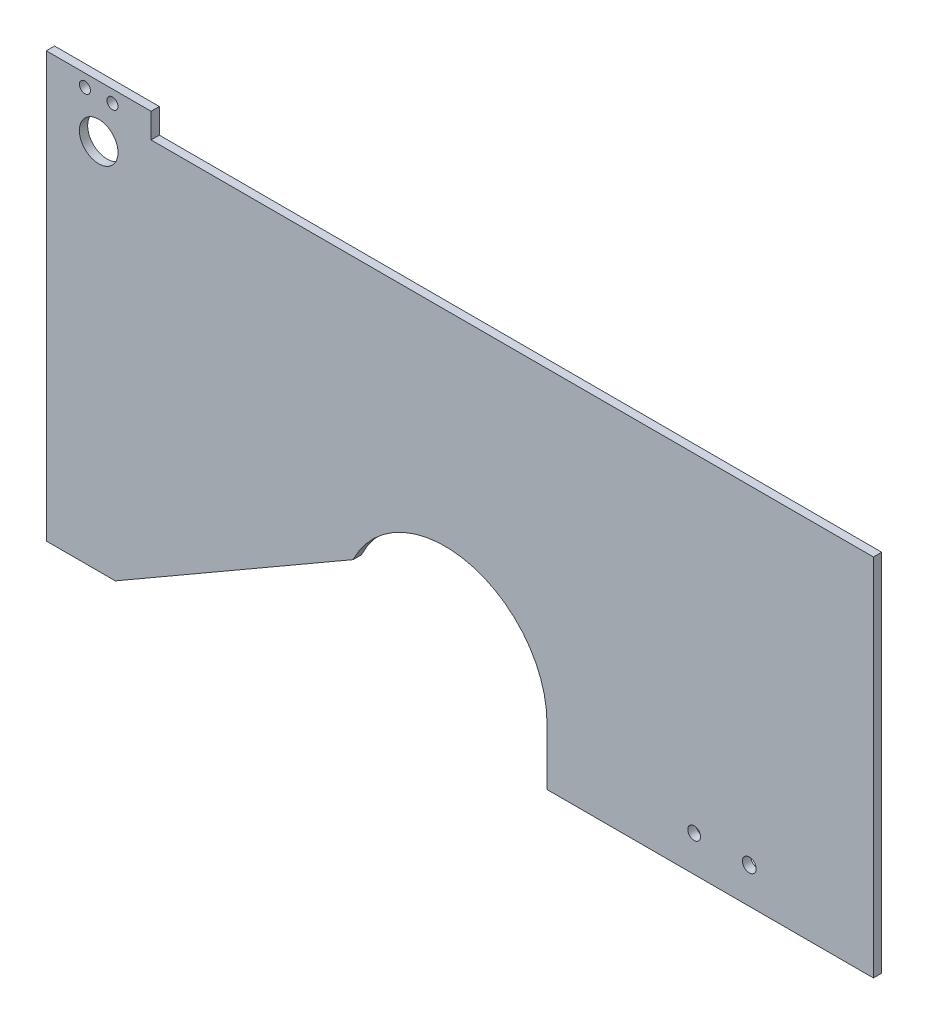
ISO-10303-21;
HEADER;
FILE_DESCRIPTION(('STEP AP214'),'2;1');
FILE_NAME('part.step','',(''),(''),'','','');
FILE_SCHEMA(('AUTOMOTIVE_DESIGN { 1 0 10303 214 1 1 1 1 }'));
ENDSEC;
DATA;
#1=APPLICATION_CONTEXT('core data for automotive mechanical design processes');
#2=APPLICATION_PROTOCOL_DEFINITION('international standard','automotive_design',2000,#1);
#3=PRODUCT_CONTEXT('',#1,'mechanical');
#4=PRODUCT('Part','Part','',(#3));
#5=PRODUCT_RELATED_PRODUCT_CATEGORY('part','',(#4));
#6=PRODUCT_DEFINITION_FORMATION('','',#4);
#7=PRODUCT_DEFINITION_CONTEXT('part definition',#1,'design');
#8=PRODUCT_DEFINITION('design','',#6,#7);
#9=PRODUCT_DEFINITION_SHAPE('','',#8);
#10=(LENGTH_UNIT() NAMED_UNIT(*) SI_UNIT(.MILLI.,.METRE.));
#11=(NAMED_UNIT(*) PLANE_ANGLE_UNIT() SI_UNIT($,.RADIAN.));
#12=(NAMED_UNIT(*) SI_UNIT($,.STERADIAN.) SOLID_ANGLE_UNIT());
#13=UNCERTAINTY_MEASURE_WITH_UNIT(LENGTH_MEASURE(1.E-05),#10,'distance_accuracy_value','');
#14=(GEOMETRIC_REPRESENTATION_CONTEXT(3) GLOBAL_UNCERTAINTY_ASSIGNED_CONTEXT((#13)) GLOBAL_UNIT_ASSIGNED_CONTEXT((#10,
#11,#12)) REPRESENTATION_CONTEXT('',''));
#15=CARTESIAN_POINT('',(0.,0.,0.));
#16=DIRECTION('',(0.,0.,1.));
#17=DIRECTION('',(1.,0.,0.));
#18=AXIS2_PLACEMENT_3D('',#15,#16,#17);
#19=CARTESIAN_POINT('',(144.6,33.7,3.));
#20=DIRECTION('',(0.,0.,1.));
#21=DIRECTION('',(1.,0.,0.));
#22=AXIS2_PLACEMENT_3D('',#19,#20,#21);
#23=PLANE('',#22);
#24=CARTESIAN_POINT('',(254.98,25.75,3.));
#25=DIRECTION('',(0.,0.,1.));
#26=DIRECTION('',(1.,0.,0.));
#27=AXIS2_PLACEMENT_3D('',#24,#25,#26);
#28=CIRCLE('',#27,2.50000000000002);
#29=CARTESIAN_POINT('',(257.48,25.75,3.));
#30=VERTEX_POINT('',#29);
#31=EDGE_CURVE('E278',#30,#30,#28,.T.);
#32=ORIENTED_EDGE('',*,*,#31,.F.);
#33=EDGE_LOOP('',(#32));
#34=FACE_BOUND('',#33,.T.);
#35=CARTESIAN_POINT('',(234.98,25.75,3.));
#36=DIRECTION('',(0.,0.,1.));
#37=DIRECTION('',(1.,0.,0.));
#38=AXIS2_PLACEMENT_3D('',#35,#36,#37);
#39=CIRCLE('',#38,2.30606373485607);
#40=CARTESIAN_POINT('',(237.286063734856,25.75,3.));
#41=VERTEX_POINT('',#40);
#42=EDGE_CURVE('E270',#41,#41,#39,.T.);
#43=ORIENTED_EDGE('',*,*,#42,.F.);
#44=EDGE_LOOP('',(#43));
#45=FACE_BOUND('',#44,.T.);
#46=DIRECTION('',(-1.,0.,0.));
#47=VECTOR('',#46,1.);
#48=CARTESIAN_POINT('',(181.6,12.75,3.));
#49=LINE('',#48,#47);
#50=CARTESIAN_POINT('',(300.,12.75,3.));
#51=VERTEX_POINT('',#50);
#52=CARTESIAN_POINT('',(181.6,12.75,3.));
#53=VERTEX_POINT('',#52);
#54=EDGE_CURVE('E263',#51,#53,#49,.T.);
#55=ORIENTED_EDGE('',*,*,#54,.F.);
#56=DIRECTION('',(0.,1.,0.));
#57=VECTOR('',#56,1.);
#58=CARTESIAN_POINT('',(300.,0.,3.));
#59=LINE('',#58,#57);
#60=CARTESIAN_POINT('',(300.,145.,3.));
#61=VERTEX_POINT('',#60);
#62=EDGE_CURVE('E128',#51,#61,#59,.T.);
#63=ORIENTED_EDGE('',*,*,#62,.T.);
#64=DIRECTION('',(-1.,0.,0.));
#65=VECTOR('',#64,1.);
#66=CARTESIAN_POINT('',(38.,145.,3.));
#67=LINE('',#66,#65);
#68=CARTESIAN_POINT('',(38.,145.,3.));
#69=VERTEX_POINT('',#68);
#70=EDGE_CURVE('E120',#61,#69,#67,.T.);
#71=ORIENTED_EDGE('',*,*,#70,.T.);
#72=DIRECTION('',(0.,1.,0.));
#73=VECTOR('',#72,1.);
#74=CARTESIAN_POINT('',(38.,154.,3.));
#75=LINE('',#74,#73);
#76=CARTESIAN_POINT('',(38.,154.,3.));
#77=VERTEX_POINT('',#76);
#78=EDGE_CURVE('E125',#69,#77,#75,.T.);
#79=ORIENTED_EDGE('',*,*,#78,.T.);
#80=DIRECTION('',(-1.,0.,0.));
#81=VECTOR('',#80,1.);
#82=CARTESIAN_POINT('',(19.,154.,3.));
#83=LINE('',#82,#81);
#84=CARTESIAN_POINT('',(0.,154.,3.));
#85=VERTEX_POINT('',#84);
#86=EDGE_CURVE('E64',#77,#85,#83,.T.);
#87=ORIENTED_EDGE('',*,*,#86,.T.);
#88=DIRECTION('',(0.,-1.,0.));
#89=VECTOR('',#88,1.);
#90=CARTESIAN_POINT('',(0.,0.,3.));
#91=LINE('',#90,#89);
#92=CARTESIAN_POINT('',(0.,0.,3.));
#93=VERTEX_POINT('',#92);
#94=EDGE_CURVE('E182',#85,#93,#91,.T.);
#95=ORIENTED_EDGE('',*,*,#94,.T.);
#96=DIRECTION('',(1.,0.,0.));
#97=VECTOR('',#96,1.);
#98=CARTESIAN_POINT('',(0.,0.,3.));
#99=LINE('',#98,#97);
#100=CARTESIAN_POINT('',(25.030359010412,0.,3.));
#101=VERTEX_POINT('',#100);
#102=EDGE_CURVE('E104',#93,#101,#99,.T.);
#103=ORIENTED_EDGE('',*,*,#102,.T.);
#104=DIRECTION('',(0.866025403784438,0.500000000000001,0.));
#105=VECTOR('',#104,1.);
#106=CARTESIAN_POINT('',(25.030359010412,0.,3.));
#107=LINE('',#106,#105);
#108=CARTESIAN_POINT('',(111.286489227342,49.8000000000001,3.));
#109=VERTEX_POINT('',#108);
#110=EDGE_CURVE('E203',#101,#109,#107,.T.);
#111=ORIENTED_EDGE('',*,*,#110,.T.);
#112=CARTESIAN_POINT('',(144.6,33.7,3.));
#113=DIRECTION('',(0.,0.,-1.));
#114=DIRECTION('',(1.,0.,0.));
#115=AXIS2_PLACEMENT_3D('',#112,#113,#114);
#116=CIRCLE('',#115,37.);
#117=CARTESIAN_POINT('',(181.6,33.7,3.));
#118=VERTEX_POINT('',#117);
#119=EDGE_CURVE('E223',#109,#118,#116,.T.);
#120=ORIENTED_EDGE('',*,*,#119,.T.);
#121=DIRECTION('',(0.,-1.,0.));
#122=VECTOR('',#121,1.);
#123=CARTESIAN_POINT('',(181.6,33.7,3.));
#124=LINE('',#123,#122);
#125=EDGE_CURVE('E220',#118,#53,#124,.T.);
#126=ORIENTED_EDGE('',*,*,#125,.T.);
#127=EDGE_LOOP('',(#55,#63,#71,#79,#87,#95,#103,#111,#120,#126));
#128=FACE_BOUND('',#127,.T.);
#129=CARTESIAN_POINT('',(14.,149.5,3.));
#130=DIRECTION('',(0.,0.,1.));
#131=DIRECTION('',(1.,0.,0.));
#132=AXIS2_PLACEMENT_3D('',#129,#130,#131);
#133=CIRCLE('',#132,2.00000000000001);
#134=CARTESIAN_POINT('',(16.,149.5,3.));
#135=VERTEX_POINT('',#134);
#136=EDGE_CURVE('E239',#135,#135,#133,.T.);
#137=ORIENTED_EDGE('',*,*,#136,.F.);
#138=EDGE_LOOP('',(#137));
#139=FACE_BOUND('',#138,.T.);
#140=CARTESIAN_POINT('',(19.,135.,3.));
#141=DIRECTION('',(0.,0.,1.));
#142=DIRECTION('',(1.,0.,0.));
#143=AXIS2_PLACEMENT_3D('',#140,#141,#142);
#144=CIRCLE('',#143,7.);
#145=CARTESIAN_POINT('',(26.,135.,3.));
#146=VERTEX_POINT('',#145);
#147=EDGE_CURVE('E159',#146,#146,#144,.T.);
#148=ORIENTED_EDGE('',*,*,#147,.F.);
#149=EDGE_LOOP('',(#148));
#150=FACE_BOUND('',#149,.T.);
#151=CARTESIAN_POINT('',(24.,149.5,3.));
#152=DIRECTION('',(0.,0.,1.));
#153=DIRECTION('',(-1.,0.,0.));
#154=AXIS2_PLACEMENT_3D('',#151,#152,#153);
#155=CIRCLE('',#154,2.00000000000001);
#156=CARTESIAN_POINT('',(22.,149.5,3.));
#157=VERTEX_POINT('',#156);
#158=EDGE_CURVE('E247',#157,#157,#155,.T.);
#159=ORIENTED_EDGE('',*,*,#158,.F.);
#160=EDGE_LOOP('',(#159));
#161=FACE_BOUND('',#160,.T.);
#162=ADVANCED_FACE('F39',(#34,#45,#128,#139,#150,#161),#23,.T.);
#163=CARTESIAN_POINT('',(144.6,33.7,0.));
#164=DIRECTION('',(0.,0.,1.));
#165=DIRECTION('',(1.,0.,0.));
#166=AXIS2_PLACEMENT_3D('',#163,#164,#165);
#167=PLANE('',#166);
#168=CARTESIAN_POINT('',(254.98,25.75,0.));
#169=DIRECTION('',(0.,0.,1.));
#170=DIRECTION('',(1.,0.,0.));
#171=AXIS2_PLACEMENT_3D('',#168,#169,#170);
#172=CIRCLE('',#171,2.50000000000002);
#173=CARTESIAN_POINT('',(257.48,25.75,0.));
#174=VERTEX_POINT('',#173);
#175=EDGE_CURVE('E267',#174,#174,#172,.T.);
#176=ORIENTED_EDGE('',*,*,#175,.T.);
#177=EDGE_LOOP('',(#176));
#178=FACE_BOUND('',#177,.T.);
#179=CARTESIAN_POINT('',(234.98,25.75,0.));
#180=DIRECTION('',(0.,0.,1.));
#181=DIRECTION('',(1.,0.,0.));
#182=AXIS2_PLACEMENT_3D('',#179,#180,#181);
#183=CIRCLE('',#182,2.30606373485607);
#184=CARTESIAN_POINT('',(237.286063734856,25.75,0.));
#185=VERTEX_POINT('',#184);
#186=EDGE_CURVE('E274',#185,#185,#183,.T.);
#187=ORIENTED_EDGE('',*,*,#186,.T.);
#188=EDGE_LOOP('',(#187));
#189=FACE_BOUND('',#188,.T.);
#190=DIRECTION('',(0.,1.,0.));
#191=VECTOR('',#190,1.);
#192=CARTESIAN_POINT('',(300.,0.,0.));
#193=LINE('',#192,#191);
#194=CARTESIAN_POINT('',(300.,12.75,0.));
#195=VERTEX_POINT('',#194);
#196=CARTESIAN_POINT('',(300.,145.,0.));
#197=VERTEX_POINT('',#196);
#198=EDGE_CURVE('E172',#195,#197,#193,.T.);
#199=ORIENTED_EDGE('',*,*,#198,.F.);
#200=DIRECTION('',(-1.,0.,0.));
#201=VECTOR('',#200,1.);
#202=CARTESIAN_POINT('',(181.6,12.75,0.));
#203=LINE('',#202,#201);
#204=CARTESIAN_POINT('',(181.6,12.75,0.));
#205=VERTEX_POINT('',#204);
#206=EDGE_CURVE('E55',#195,#205,#203,.T.);
#207=ORIENTED_EDGE('',*,*,#206,.T.);
#208=DIRECTION('',(0.,-1.,0.));
#209=VECTOR('',#208,1.);
#210=CARTESIAN_POINT('',(181.6,33.7,0.));
#211=LINE('',#210,#209);
#212=CARTESIAN_POINT('',(181.6,33.7,0.));
#213=VERTEX_POINT('',#212);
#214=EDGE_CURVE('E168',#213,#205,#211,.T.);
#215=ORIENTED_EDGE('',*,*,#214,.F.);
#216=CARTESIAN_POINT('',(144.6,33.7,0.));
#217=DIRECTION('',(0.,0.,-1.));
#218=DIRECTION('',(1.,0.,0.));
#219=AXIS2_PLACEMENT_3D('',#216,#217,#218);
#220=CIRCLE('',#219,37.);
#221=CARTESIAN_POINT('',(111.286489227342,49.8000000000001,0.));
#222=VERTEX_POINT('',#221);
#223=EDGE_CURVE('E165',#222,#213,#220,.T.);
#224=ORIENTED_EDGE('',*,*,#223,.F.);
#225=DIRECTION('',(0.866025403784438,0.500000000000001,0.));
#226=VECTOR('',#225,1.);
#227=CARTESIAN_POINT('',(25.030359010412,0.,0.));
#228=LINE('',#227,#226);
#229=CARTESIAN_POINT('',(25.030359010412,0.,0.));
#230=VERTEX_POINT('',#229);
#231=EDGE_CURVE('E162',#230,#222,#228,.T.);
#232=ORIENTED_EDGE('',*,*,#231,.F.);
#233=DIRECTION('',(1.,0.,0.));
#234=VECTOR('',#233,1.);
#235=CARTESIAN_POINT('',(0.,0.,0.));
#236=LINE('',#235,#234);
#237=CARTESIAN_POINT('',(0.,0.,0.));
#238=VERTEX_POINT('',#237);
#239=EDGE_CURVE('E158',#238,#230,#236,.T.);
#240=ORIENTED_EDGE('',*,*,#239,.F.);
#241=DIRECTION('',(0.,-1.,0.));
#242=VECTOR('',#241,1.);
#243=CARTESIAN_POINT('',(0.,0.,0.));
#244=LINE('',#243,#242);
#245=CARTESIAN_POINT('',(0.,154.,0.));
#246=VERTEX_POINT('',#245);
#247=EDGE_CURVE('E154',#246,#238,#244,.T.);
#248=ORIENTED_EDGE('',*,*,#247,.F.);
#249=DIRECTION('',(-1.,0.,0.));
#250=VECTOR('',#249,1.);
#251=CARTESIAN_POINT('',(0.,154.,0.));
#252=LINE('',#251,#250);
#253=CARTESIAN_POINT('',(38.,154.,0.));
#254=VERTEX_POINT('',#253);
#255=EDGE_CURVE('E96',#254,#246,#252,.T.);
#256=ORIENTED_EDGE('',*,*,#255,.F.);
#257=DIRECTION('',(0.,1.,0.));
#258=VECTOR('',#257,1.);
#259=CARTESIAN_POINT('',(38.,154.,0.));
#260=LINE('',#259,#258);
#261=CARTESIAN_POINT('',(38.,145.,0.));
#262=VERTEX_POINT('',#261);
#263=EDGE_CURVE('E177',#262,#254,#260,.T.);
#264=ORIENTED_EDGE('',*,*,#263,.F.);
#265=DIRECTION('',(-1.,0.,0.));
#266=VECTOR('',#265,1.);
#267=CARTESIAN_POINT('',(38.,145.,0.));
#268=LINE('',#267,#266);
#269=EDGE_CURVE('E138',#197,#262,#268,.T.);
#270=ORIENTED_EDGE('',*,*,#269,.F.);
#271=EDGE_LOOP('',(#199,#207,#215,#224,#232,#240,#248,#256,#264,#270));
#272=FACE_BOUND('',#271,.T.);
#273=CARTESIAN_POINT('',(19.,135.,0.));
#274=DIRECTION('',(0.,0.,1.));
#275=DIRECTION('',(1.,0.,0.));
#276=AXIS2_PLACEMENT_3D('',#273,#274,#275);
#277=CIRCLE('',#276,7.);
#278=CARTESIAN_POINT('',(26.,135.,0.));
#279=VERTEX_POINT('',#278);
#280=EDGE_CURVE('E235',#279,#279,#277,.T.);
#281=ORIENTED_EDGE('',*,*,#280,.T.);
#282=EDGE_LOOP('',(#281));
#283=FACE_BOUND('',#282,.T.);
#284=CARTESIAN_POINT('',(14.,149.5,0.));
#285=DIRECTION('',(0.,0.,1.));
#286=DIRECTION('',(1.,0.,0.));
#287=AXIS2_PLACEMENT_3D('',#284,#285,#286);
#288=CIRCLE('',#287,2.00000000000001);
#289=CARTESIAN_POINT('',(16.,149.5,0.));
#290=VERTEX_POINT('',#289);
#291=EDGE_CURVE('E243',#290,#290,#288,.T.);
#292=ORIENTED_EDGE('',*,*,#291,.T.);
#293=EDGE_LOOP('',(#292));
#294=FACE_BOUND('',#293,.T.);
#295=CARTESIAN_POINT('',(24.,149.5,0.));
#296=DIRECTION('',(0.,0.,1.));
#297=DIRECTION('',(-1.,0.,0.));
#298=AXIS2_PLACEMENT_3D('',#295,#296,#297);
#299=CIRCLE('',#298,2.00000000000001);
#300=CARTESIAN_POINT('',(22.,149.5,0.));
#301=VERTEX_POINT('',#300);
#302=EDGE_CURVE('E251',#301,#301,#299,.T.);
#303=ORIENTED_EDGE('',*,*,#302,.T.);
#304=EDGE_LOOP('',(#303));
#305=FACE_BOUND('',#304,.T.);
#306=ADVANCED_FACE('F207',(#178,#189,#272,#283,#294,#305),#167,.F.);
#307=CARTESIAN_POINT('',(0.,0.,3.));
#308=DIRECTION('',(1.,0.,0.));
#309=DIRECTION('',(0.,0.,-1.));
#310=AXIS2_PLACEMENT_3D('',#307,#308,#309);
#311=PLANE('',#310);
#312=ORIENTED_EDGE('',*,*,#247,.T.);
#313=DIRECTION('',(0.,0.,-1.));
#314=VECTOR('',#313,1.);
#315=CARTESIAN_POINT('',(0.,0.,3.));
#316=LINE('',#315,#314);
#317=EDGE_CURVE('E11',#93,#238,#316,.T.);
#318=ORIENTED_EDGE('',*,*,#317,.F.);
#319=ORIENTED_EDGE('',*,*,#94,.F.);
#320=DIRECTION('',(0.,0.,-1.));
#321=VECTOR('',#320,1.);
#322=CARTESIAN_POINT('',(0.,154.,3.));
#323=LINE('',#322,#321);
#324=EDGE_CURVE('E150',#85,#246,#323,.T.);
#325=ORIENTED_EDGE('',*,*,#324,.T.);
#326=EDGE_LOOP('',(#312,#318,#319,#325));
#327=FACE_BOUND('',#326,.T.);
#328=ADVANCED_FACE('F41',(#327),#311,.F.);
#329=CARTESIAN_POINT('',(0.,0.,3.));
#330=DIRECTION('',(0.,1.,0.));
#331=DIRECTION('',(0.,0.,1.));
#332=AXIS2_PLACEMENT_3D('',#329,#330,#331);
#333=PLANE('',#332);
#334=ORIENTED_EDGE('',*,*,#239,.T.);
#335=DIRECTION('',(0.,0.,-1.));
#336=VECTOR('',#335,1.);
#337=CARTESIAN_POINT('',(25.030359010412,0.,3.));
#338=LINE('',#337,#336);
#339=EDGE_CURVE('E48',#101,#230,#338,.T.);
#340=ORIENTED_EDGE('',*,*,#339,.F.);
#341=ORIENTED_EDGE('',*,*,#102,.F.);
#342=ORIENTED_EDGE('',*,*,#317,.T.);
#343=EDGE_LOOP('',(#334,#340,#341,#342));
#344=FACE_BOUND('',#343,.T.);
#345=ADVANCED_FACE('F340',(#344),#333,.F.);
#346=CARTESIAN_POINT('',(25.030359010412,0.,3.));
#347=DIRECTION('',(-0.500000000000001,0.866025403784438,0.));
#348=DIRECTION('',(-0.866025403784438,-0.500000000000001,0.));
#349=AXIS2_PLACEMENT_3D('',#346,#347,#348);
#350=PLANE('',#349);
#351=ORIENTED_EDGE('',*,*,#231,.T.);
#352=DIRECTION('',(0.,0.,-1.));
#353=VECTOR('',#352,1.);
#354=CARTESIAN_POINT('',(111.286489227342,49.8000000000001,3.));
#355=LINE('',#354,#353);
#356=EDGE_CURVE('E193',#109,#222,#355,.T.);
#357=ORIENTED_EDGE('',*,*,#356,.F.);
#358=ORIENTED_EDGE('',*,*,#110,.F.);
#359=ORIENTED_EDGE('',*,*,#339,.T.);
#360=EDGE_LOOP('',(#351,#357,#358,#359));
#361=FACE_BOUND('',#360,.T.);
#362=ADVANCED_FACE('F201',(#361),#350,.F.);
#363=CARTESIAN_POINT('',(144.6,33.7,3.));
#364=DIRECTION('',(0.,0.,-1.));
#365=DIRECTION('',(-1.,0.,0.));
#366=AXIS2_PLACEMENT_3D('',#363,#364,#365);
#367=CYLINDRICAL_SURFACE('',#366,37.);
#368=ORIENTED_EDGE('',*,*,#223,.T.);
#369=DIRECTION('',(0.,0.,-1.));
#370=VECTOR('',#369,1.);
#371=CARTESIAN_POINT('',(181.6,33.7,3.));
#372=LINE('',#371,#370);
#373=EDGE_CURVE('E189',#118,#213,#372,.T.);
#374=ORIENTED_EDGE('',*,*,#373,.F.);
#375=ORIENTED_EDGE('',*,*,#119,.F.);
#376=ORIENTED_EDGE('',*,*,#356,.T.);
#377=EDGE_LOOP('',(#368,#374,#375,#376));
#378=FACE_BOUND('',#377,.T.);
#379=ADVANCED_FACE('F213',(#378),#367,.F.);
#380=CARTESIAN_POINT('',(181.6,33.7,3.));
#381=DIRECTION('',(1.,0.,0.));
#382=DIRECTION('',(0.,0.,-1.));
#383=AXIS2_PLACEMENT_3D('',#380,#381,#382);
#384=PLANE('',#383);
#385=ORIENTED_EDGE('',*,*,#214,.T.);
#386=DIRECTION('',(0.,0.,1.));
#387=VECTOR('',#386,1.);
#388=CARTESIAN_POINT('',(181.6,12.75,0.));
#389=LINE('',#388,#387);
#390=EDGE_CURVE('E221',#205,#53,#389,.T.);
#391=ORIENTED_EDGE('',*,*,#390,.T.);
#392=ORIENTED_EDGE('',*,*,#125,.F.);
#393=ORIENTED_EDGE('',*,*,#373,.T.);
#394=EDGE_LOOP('',(#385,#391,#392,#393));
#395=FACE_BOUND('',#394,.T.);
#396=ADVANCED_FACE('F217',(#395),#384,.F.);
#397=CARTESIAN_POINT('',(300.,0.,3.));
#398=DIRECTION('',(-1.,0.,0.));
#399=DIRECTION('',(0.,0.,1.));
#400=AXIS2_PLACEMENT_3D('',#397,#398,#399);
#401=PLANE('',#400);
#402=ORIENTED_EDGE('',*,*,#62,.F.);
#403=DIRECTION('',(0.,0.,1.));
#404=VECTOR('',#403,1.);
#405=CARTESIAN_POINT('',(300.,12.75,0.));
#406=LINE('',#405,#404);
#407=EDGE_CURVE('E258',#195,#51,#406,.T.);
#408=ORIENTED_EDGE('',*,*,#407,.F.);
#409=ORIENTED_EDGE('',*,*,#198,.T.);
#410=DIRECTION('',(0.,0.,-1.));
#411=VECTOR('',#410,1.);
#412=CARTESIAN_POINT('',(300.,145.,3.));
#413=LINE('',#412,#411);
#414=EDGE_CURVE('E143',#61,#197,#413,.T.);
#415=ORIENTED_EDGE('',*,*,#414,.F.);
#416=EDGE_LOOP('',(#402,#408,#409,#415));
#417=FACE_BOUND('',#416,.T.);
#418=ADVANCED_FACE('F331',(#417),#401,.F.);
#419=CARTESIAN_POINT('',(38.,145.,3.));
#420=DIRECTION('',(0.,-1.,0.));
#421=DIRECTION('',(0.,0.,-1.));
#422=AXIS2_PLACEMENT_3D('',#419,#420,#421);
#423=PLANE('',#422);
#424=ORIENTED_EDGE('',*,*,#269,.T.);
#425=DIRECTION('',(0.,0.,-1.));
#426=VECTOR('',#425,1.);
#427=CARTESIAN_POINT('',(38.,145.,3.));
#428=LINE('',#427,#426);
#429=EDGE_CURVE('E135',#69,#262,#428,.T.);
#430=ORIENTED_EDGE('',*,*,#429,.F.);
#431=ORIENTED_EDGE('',*,*,#70,.F.);
#432=ORIENTED_EDGE('',*,*,#414,.T.);
#433=EDGE_LOOP('',(#424,#430,#431,#432));
#434=FACE_BOUND('',#433,.T.);
#435=ADVANCED_FACE('F136',(#434),#423,.F.);
#436=CARTESIAN_POINT('',(38.,154.,3.));
#437=DIRECTION('',(-1.,0.,0.));
#438=DIRECTION('',(0.,0.,1.));
#439=AXIS2_PLACEMENT_3D('',#436,#437,#438);
#440=PLANE('',#439);
#441=ORIENTED_EDGE('',*,*,#263,.T.);
#442=DIRECTION('',(0.,0.,-1.));
#443=VECTOR('',#442,1.);
#444=CARTESIAN_POINT('',(38.,154.,3.));
#445=LINE('',#444,#443);
#446=EDGE_CURVE('E144',#77,#254,#445,.T.);
#447=ORIENTED_EDGE('',*,*,#446,.F.);
#448=ORIENTED_EDGE('',*,*,#78,.F.);
#449=ORIENTED_EDGE('',*,*,#429,.T.);
#450=EDGE_LOOP('',(#441,#447,#448,#449));
#451=FACE_BOUND('',#450,.T.);
#452=ADVANCED_FACE('F146',(#451),#440,.F.);
#453=CARTESIAN_POINT('',(0.,154.,3.));
#454=DIRECTION('',(0.,-1.,0.));
#455=DIRECTION('',(0.,0.,-1.));
#456=AXIS2_PLACEMENT_3D('',#453,#454,#455);
#457=PLANE('',#456);
#458=ORIENTED_EDGE('',*,*,#255,.T.);
#459=ORIENTED_EDGE('',*,*,#324,.F.);
#460=ORIENTED_EDGE('',*,*,#86,.F.);
#461=ORIENTED_EDGE('',*,*,#446,.T.);
#462=EDGE_LOOP('',(#458,#459,#460,#461));
#463=FACE_BOUND('',#462,.T.);
#464=ADVANCED_FACE('F320',(#463),#457,.F.);
#465=CARTESIAN_POINT('',(19.,135.,3.));
#466=DIRECTION('',(0.,0.,-1.));
#467=DIRECTION('',(-1.,0.,0.));
#468=AXIS2_PLACEMENT_3D('',#465,#466,#467);
#469=CYLINDRICAL_SURFACE('',#468,7.);
#470=ORIENTED_EDGE('',*,*,#147,.T.);
#471=EDGE_LOOP('',(#470));
#472=FACE_BOUND('',#471,.T.);
#473=ORIENTED_EDGE('',*,*,#280,.F.);
#474=EDGE_LOOP('',(#473));
#475=FACE_BOUND('',#474,.T.);
#476=ADVANCED_FACE('F317',(#472,#475),#469,.F.);
#477=CARTESIAN_POINT('',(14.,149.5,3.));
#478=DIRECTION('',(0.,0.,-1.));
#479=DIRECTION('',(-1.,0.,0.));
#480=AXIS2_PLACEMENT_3D('',#477,#478,#479);
#481=CYLINDRICAL_SURFACE('',#480,2.00000000000001);
#482=ORIENTED_EDGE('',*,*,#136,.T.);
#483=EDGE_LOOP('',(#482));
#484=FACE_BOUND('',#483,.T.);
#485=ORIENTED_EDGE('',*,*,#291,.F.);
#486=EDGE_LOOP('',(#485));
#487=FACE_BOUND('',#486,.T.);
#488=ADVANCED_FACE('F313',(#484,#487),#481,.F.);
#489=CARTESIAN_POINT('',(24.,149.5,3.));
#490=DIRECTION('',(0.,0.,-1.));
#491=DIRECTION('',(-1.,0.,0.));
#492=AXIS2_PLACEMENT_3D('',#489,#490,#491);
#493=CYLINDRICAL_SURFACE('',#492,2.00000000000001);
#494=ORIENTED_EDGE('',*,*,#158,.T.);
#495=EDGE_LOOP('',(#494));
#496=FACE_BOUND('',#495,.T.);
#497=ORIENTED_EDGE('',*,*,#302,.F.);
#498=EDGE_LOOP('',(#497));
#499=FACE_BOUND('',#498,.T.);
#500=ADVANCED_FACE('F307',(#496,#499),#493,.F.);
#501=CARTESIAN_POINT('',(181.6,12.75,0.));
#502=DIRECTION('',(0.,1.,0.));
#503=DIRECTION('',(0.,0.,1.));
#504=AXIS2_PLACEMENT_3D('',#501,#502,#503);
#505=PLANE('',#504);
#506=ORIENTED_EDGE('',*,*,#54,.T.);
#507=ORIENTED_EDGE('',*,*,#390,.F.);
#508=ORIENTED_EDGE('',*,*,#206,.F.);
#509=ORIENTED_EDGE('',*,*,#407,.T.);
#510=EDGE_LOOP('',(#506,#507,#508,#509));
#511=FACE_BOUND('',#510,.T.);
#512=ADVANCED_FACE('F301',(#511),#505,.F.);
#513=CARTESIAN_POINT('',(234.98,25.75,0.));
#514=DIRECTION('',(0.,0.,1.));
#515=DIRECTION('',(1.,0.,0.));
#516=AXIS2_PLACEMENT_3D('',#513,#514,#515);
#517=CYLINDRICAL_SURFACE('',#516,2.30606373485607);
#518=ORIENTED_EDGE('',*,*,#186,.F.);
#519=EDGE_LOOP('',(#518));
#520=FACE_BOUND('',#519,.T.);
#521=ORIENTED_EDGE('',*,*,#42,.T.);
#522=EDGE_LOOP('',(#521));
#523=FACE_BOUND('',#522,.T.);
#524=ADVANCED_FACE('F291',(#520,#523),#517,.F.);
#525=CARTESIAN_POINT('',(254.98,25.75,0.));
#526=DIRECTION('',(0.,0.,1.));
#527=DIRECTION('',(1.,0.,0.));
#528=AXIS2_PLACEMENT_3D('',#525,#526,#527);
#529=CYLINDRICAL_SURFACE('',#528,2.50000000000002);
#530=ORIENTED_EDGE('',*,*,#175,.F.);
#531=EDGE_LOOP('',(#530));
#532=FACE_BOUND('',#531,.T.);
#533=ORIENTED_EDGE('',*,*,#31,.T.);
#534=EDGE_LOOP('',(#533));
#535=FACE_BOUND('',#534,.T.);
#536=ADVANCED_FACE('F288',(#532,#535),#529,.F.);
#537=CLOSED_SHELL('',(#162,#306,#328,#345,#362,#379,#396,#418,#435,#452,#464,#476,#488,#500,
#512,#524,#536));
#538=MANIFOLD_SOLID_BREP('B2',#537);
#539=ADVANCED_BREP_SHAPE_REPRESENTATION('',(#18,#538),#14);
#540=SHAPE_DEFINITION_REPRESENTATION(#9,#539);
ENDSEC;
END-ISO-10303-21;
